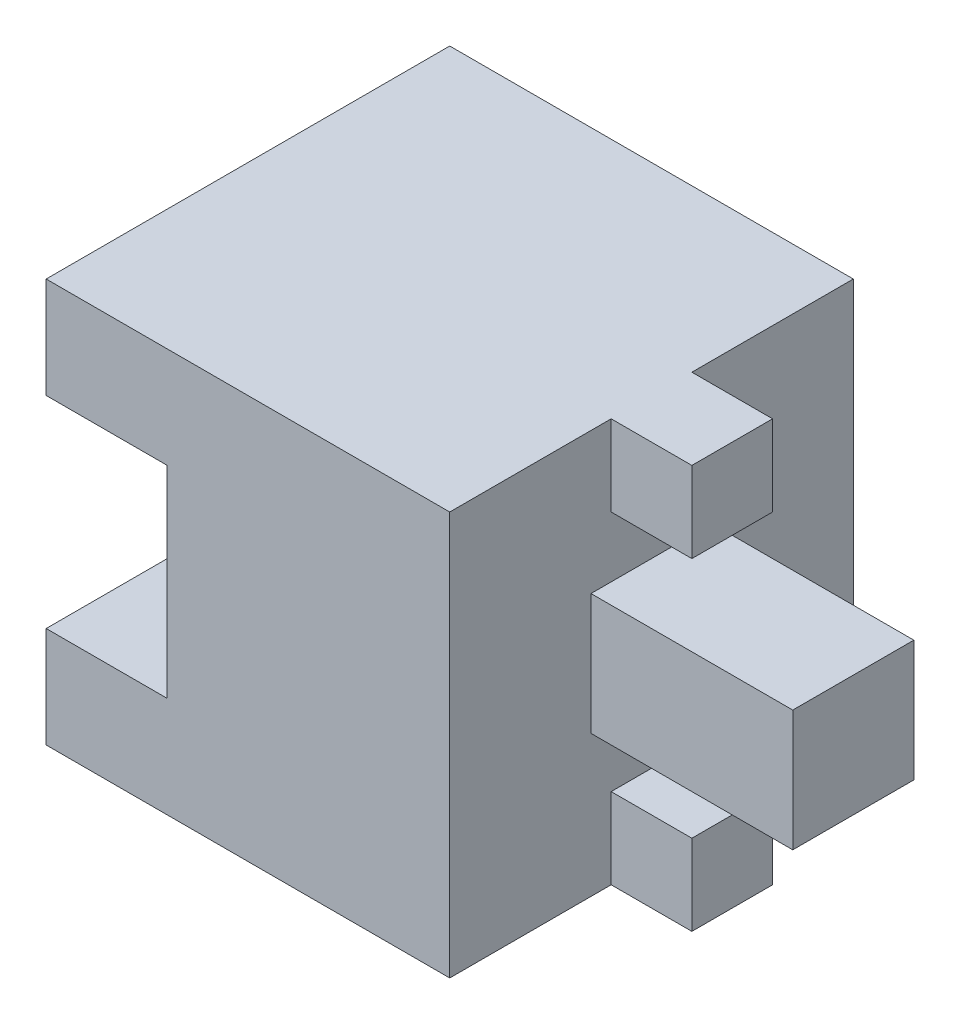
ISO-10303-21;
HEADER;
FILE_DESCRIPTION(('STEP AP214'),'2;1');
FILE_NAME('part.step','',(''),(''),'','','');
FILE_SCHEMA(('AUTOMOTIVE_DESIGN { 1 0 10303 214 1 1 1 1 }'));
ENDSEC;
DATA;
#1=APPLICATION_CONTEXT('core data for automotive mechanical design processes');
#2=APPLICATION_PROTOCOL_DEFINITION('international standard','automotive_design',2000,#1);
#3=PRODUCT_CONTEXT('',#1,'mechanical');
#4=PRODUCT('Part','Part','',(#3));
#5=PRODUCT_RELATED_PRODUCT_CATEGORY('part','',(#4));
#6=PRODUCT_DEFINITION_FORMATION('','',#4);
#7=PRODUCT_DEFINITION_CONTEXT('part definition',#1,'design');
#8=PRODUCT_DEFINITION('design','',#6,#7);
#9=PRODUCT_DEFINITION_SHAPE('','',#8);
#10=(LENGTH_UNIT() NAMED_UNIT(*) SI_UNIT(.MILLI.,.METRE.));
#11=(NAMED_UNIT(*) PLANE_ANGLE_UNIT() SI_UNIT($,.RADIAN.));
#12=(NAMED_UNIT(*) SI_UNIT($,.STERADIAN.) SOLID_ANGLE_UNIT());
#13=UNCERTAINTY_MEASURE_WITH_UNIT(LENGTH_MEASURE(1.E-05),#10,'distance_accuracy_value','');
#14=(GEOMETRIC_REPRESENTATION_CONTEXT(3) GLOBAL_UNCERTAINTY_ASSIGNED_CONTEXT((#13)) GLOBAL_UNIT_ASSIGNED_CONTEXT((#10,
#11,#12)) REPRESENTATION_CONTEXT('',''));
#15=CARTESIAN_POINT('',(0.,0.,0.));
#16=DIRECTION('',(0.,0.,1.));
#17=DIRECTION('',(1.,0.,0.));
#18=AXIS2_PLACEMENT_3D('',#15,#16,#17);
#19=CARTESIAN_POINT('',(5.,5.,5.));
#20=DIRECTION('',(-1.,0.,0.));
#21=DIRECTION('',(0.,0.,1.));
#22=AXIS2_PLACEMENT_3D('',#19,#20,#21);
#23=PLANE('',#22);
#24=DIRECTION('',(0.,1.,0.));
#25=VECTOR('',#24,1.);
#26=CARTESIAN_POINT('',(5.,-1.5,-1.5));
#27=LINE('',#26,#25);
#28=CARTESIAN_POINT('',(5.,-1.5,-1.5));
#29=VERTEX_POINT('',#28);
#30=CARTESIAN_POINT('',(5.,1.5,-1.5));
#31=VERTEX_POINT('',#30);
#32=EDGE_CURVE('E230',#29,#31,#27,.T.);
#33=ORIENTED_EDGE('',*,*,#32,.F.);
#34=DIRECTION('',(0.,0.,-1.));
#35=VECTOR('',#34,1.);
#36=CARTESIAN_POINT('',(5.,-1.5,1.5));
#37=LINE('',#36,#35);
#38=CARTESIAN_POINT('',(5.,-1.5,1.5));
#39=VERTEX_POINT('',#38);
#40=EDGE_CURVE('E235',#39,#29,#37,.T.);
#41=ORIENTED_EDGE('',*,*,#40,.F.);
#42=DIRECTION('',(0.,-1.,0.));
#43=VECTOR('',#42,1.);
#44=CARTESIAN_POINT('',(5.,-1.5,1.5));
#45=LINE('',#44,#43);
#46=CARTESIAN_POINT('',(5.,1.5,1.5));
#47=VERTEX_POINT('',#46);
#48=EDGE_CURVE('E247',#47,#39,#45,.T.);
#49=ORIENTED_EDGE('',*,*,#48,.F.);
#50=DIRECTION('',(0.,0.,1.));
#51=VECTOR('',#50,1.);
#52=CARTESIAN_POINT('',(5.,1.5,1.5));
#53=LINE('',#52,#51);
#54=EDGE_CURVE('E244',#31,#47,#53,.T.);
#55=ORIENTED_EDGE('',*,*,#54,.F.);
#56=EDGE_LOOP('',(#33,#41,#49,#55));
#57=FACE_BOUND('',#56,.T.);
#58=DIRECTION('',(0.,0.,-1.));
#59=VECTOR('',#58,1.);
#60=CARTESIAN_POINT('',(5.,-3.,1.));
#61=LINE('',#60,#59);
#62=CARTESIAN_POINT('',(5.,-3.,1.));
#63=VERTEX_POINT('',#62);
#64=CARTESIAN_POINT('',(5.,-3.,-1.));
#65=VERTEX_POINT('',#64);
#66=EDGE_CURVE('E47',#63,#65,#61,.T.);
#67=ORIENTED_EDGE('',*,*,#66,.T.);
#68=DIRECTION('',(0.,-1.,0.));
#69=VECTOR('',#68,1.);
#70=CARTESIAN_POINT('',(5.,-3.,-1.));
#71=LINE('',#70,#69);
#72=CARTESIAN_POINT('',(5.,-5.,-1.));
#73=VERTEX_POINT('',#72);
#74=EDGE_CURVE('E175',#65,#73,#71,.T.);
#75=ORIENTED_EDGE('',*,*,#74,.T.);
#76=DIRECTION('',(0.,0.,-1.));
#77=VECTOR('',#76,1.);
#78=CARTESIAN_POINT('',(5.,-5.,5.));
#79=LINE('',#78,#77);
#80=CARTESIAN_POINT('',(5.,-5.,-5.));
#81=VERTEX_POINT('',#80);
#82=EDGE_CURVE('E284',#73,#81,#79,.T.);
#83=ORIENTED_EDGE('',*,*,#82,.T.);
#84=DIRECTION('',(0.,-1.,0.));
#85=VECTOR('',#84,1.);
#86=CARTESIAN_POINT('',(5.,5.,-5.));
#87=LINE('',#86,#85);
#88=CARTESIAN_POINT('',(5.,5.,-5.));
#89=VERTEX_POINT('',#88);
#90=EDGE_CURVE('E11',#89,#81,#87,.T.);
#91=ORIENTED_EDGE('',*,*,#90,.F.);
#92=DIRECTION('',(0.,0.,-1.));
#93=VECTOR('',#92,1.);
#94=CARTESIAN_POINT('',(5.,5.,5.));
#95=LINE('',#94,#93);
#96=CARTESIAN_POINT('',(5.,5.,-1.));
#97=VERTEX_POINT('',#96);
#98=EDGE_CURVE('E294',#97,#89,#95,.T.);
#99=ORIENTED_EDGE('',*,*,#98,.F.);
#100=DIRECTION('',(0.,1.,0.));
#101=VECTOR('',#100,1.);
#102=CARTESIAN_POINT('',(5.,3.,-1.));
#103=LINE('',#102,#101);
#104=CARTESIAN_POINT('',(5.,3.,-1.));
#105=VERTEX_POINT('',#104);
#106=EDGE_CURVE('E178',#105,#97,#103,.T.);
#107=ORIENTED_EDGE('',*,*,#106,.F.);
#108=DIRECTION('',(0.,0.,-1.));
#109=VECTOR('',#108,1.);
#110=CARTESIAN_POINT('',(5.,3.,1.));
#111=LINE('',#110,#109);
#112=CARTESIAN_POINT('',(5.,3.,1.));
#113=VERTEX_POINT('',#112);
#114=EDGE_CURVE('E209',#113,#105,#111,.T.);
#115=ORIENTED_EDGE('',*,*,#114,.F.);
#116=DIRECTION('',(0.,-1.,0.));
#117=VECTOR('',#116,1.);
#118=CARTESIAN_POINT('',(5.,3.,1.));
#119=LINE('',#118,#117);
#120=CARTESIAN_POINT('',(5.,5.,1.));
#121=VERTEX_POINT('',#120);
#122=EDGE_CURVE('E217',#121,#113,#119,.T.);
#123=ORIENTED_EDGE('',*,*,#122,.F.);
#124=CARTESIAN_POINT('',(5.,5.,5.));
#125=VERTEX_POINT('',#124);
#126=EDGE_CURVE('E290',#125,#121,#95,.T.);
#127=ORIENTED_EDGE('',*,*,#126,.F.);
#128=DIRECTION('',(0.,-1.,0.));
#129=VECTOR('',#128,1.);
#130=CARTESIAN_POINT('',(5.,5.,5.));
#131=LINE('',#130,#129);
#132=CARTESIAN_POINT('',(5.,-5.,5.));
#133=VERTEX_POINT('',#132);
#134=EDGE_CURVE('E300',#125,#133,#131,.T.);
#135=ORIENTED_EDGE('',*,*,#134,.T.);
#136=CARTESIAN_POINT('',(5.,-5.,1.));
#137=VERTEX_POINT('',#136);
#138=EDGE_CURVE('E301',#133,#137,#79,.T.);
#139=ORIENTED_EDGE('',*,*,#138,.T.);
#140=DIRECTION('',(0.,1.,0.));
#141=VECTOR('',#140,1.);
#142=CARTESIAN_POINT('',(5.,-3.,1.));
#143=LINE('',#142,#141);
#144=EDGE_CURVE('E52',#137,#63,#143,.T.);
#145=ORIENTED_EDGE('',*,*,#144,.T.);
#146=EDGE_LOOP('',(#67,#75,#83,#91,#99,#107,#115,#123,#127,#135,#139,#145));
#147=FACE_BOUND('',#146,.T.);
#148=ADVANCED_FACE('F33',(#57,#147),#23,.F.);
#149=CARTESIAN_POINT('',(-5.,5.,5.));
#150=DIRECTION('',(1.,0.,0.));
#151=DIRECTION('',(0.,0.,-1.));
#152=AXIS2_PLACEMENT_3D('',#149,#150,#151);
#153=PLANE('',#152);
#154=DIRECTION('',(0.,-1.,0.));
#155=VECTOR('',#154,1.);
#156=CARTESIAN_POINT('',(-5.,5.,-5.));
#157=LINE('',#156,#155);
#158=CARTESIAN_POINT('',(-5.,5.,-5.));
#159=VERTEX_POINT('',#158);
#160=CARTESIAN_POINT('',(-5.,2.5,-5.));
#161=VERTEX_POINT('',#160);
#162=EDGE_CURVE('E40',#159,#161,#157,.T.);
#163=ORIENTED_EDGE('',*,*,#162,.T.);
#164=DIRECTION('',(0.,0.,1.));
#165=VECTOR('',#164,1.);
#166=CARTESIAN_POINT('',(-5.,2.5,-5.));
#167=LINE('',#166,#165);
#168=CARTESIAN_POINT('',(-5.,2.5,5.));
#169=VERTEX_POINT('',#168);
#170=EDGE_CURVE('E281',#161,#169,#167,.T.);
#171=ORIENTED_EDGE('',*,*,#170,.T.);
#172=DIRECTION('',(0.,-1.,0.));
#173=VECTOR('',#172,1.);
#174=CARTESIAN_POINT('',(-5.,5.,5.));
#175=LINE('',#174,#173);
#176=CARTESIAN_POINT('',(-5.,5.,5.));
#177=VERTEX_POINT('',#176);
#178=EDGE_CURVE('E314',#177,#169,#175,.T.);
#179=ORIENTED_EDGE('',*,*,#178,.F.);
#180=DIRECTION('',(0.,0.,1.));
#181=VECTOR('',#180,1.);
#182=CARTESIAN_POINT('',(-5.,5.,5.));
#183=LINE('',#182,#181);
#184=EDGE_CURVE('E296',#159,#177,#183,.T.);
#185=ORIENTED_EDGE('',*,*,#184,.F.);
#186=EDGE_LOOP('',(#163,#171,#179,#185));
#187=FACE_BOUND('',#186,.T.);
#188=ADVANCED_FACE('F351',(#187),#153,.F.);
#189=CARTESIAN_POINT('',(-5.,5.,-5.));
#190=DIRECTION('',(0.,0.,1.));
#191=DIRECTION('',(1.,0.,0.));
#192=AXIS2_PLACEMENT_3D('',#189,#190,#191);
#193=PLANE('',#192);
#194=DIRECTION('',(0.,1.,0.));
#195=VECTOR('',#194,1.);
#196=CARTESIAN_POINT('',(-2.,-2.5,-5.));
#197=LINE('',#196,#195);
#198=CARTESIAN_POINT('',(-2.,-2.5,-5.));
#199=VERTEX_POINT('',#198);
#200=CARTESIAN_POINT('',(-2.,2.5,-5.));
#201=VERTEX_POINT('',#200);
#202=EDGE_CURVE('E267',#199,#201,#197,.T.);
#203=ORIENTED_EDGE('',*,*,#202,.T.);
#204=DIRECTION('',(-1.,0.,0.));
#205=VECTOR('',#204,1.);
#206=CARTESIAN_POINT('',(-2.,2.5,-5.));
#207=LINE('',#206,#205);
#208=EDGE_CURVE('E271',#201,#161,#207,.T.);
#209=ORIENTED_EDGE('',*,*,#208,.T.);
#210=ORIENTED_EDGE('',*,*,#162,.F.);
#211=DIRECTION('',(-1.,0.,0.));
#212=VECTOR('',#211,1.);
#213=CARTESIAN_POINT('',(-5.,5.,-5.));
#214=LINE('',#213,#212);
#215=EDGE_CURVE('E293',#89,#159,#214,.T.);
#216=ORIENTED_EDGE('',*,*,#215,.F.);
#217=ORIENTED_EDGE('',*,*,#90,.T.);
#218=DIRECTION('',(-1.,0.,0.));
#219=VECTOR('',#218,1.);
#220=CARTESIAN_POINT('',(-5.,-5.,-5.));
#221=LINE('',#220,#219);
#222=CARTESIAN_POINT('',(-5.,-5.,-5.));
#223=VERTEX_POINT('',#222);
#224=EDGE_CURVE('E303',#81,#223,#221,.T.);
#225=ORIENTED_EDGE('',*,*,#224,.T.);
#226=CARTESIAN_POINT('',(-5.,-2.5,-5.));
#227=VERTEX_POINT('',#226);
#228=EDGE_CURVE('E316',#227,#223,#157,.T.);
#229=ORIENTED_EDGE('',*,*,#228,.F.);
#230=DIRECTION('',(1.,0.,0.));
#231=VECTOR('',#230,1.);
#232=CARTESIAN_POINT('',(-2.,-2.5,-5.));
#233=LINE('',#232,#231);
#234=EDGE_CURVE('E264',#227,#199,#233,.T.);
#235=ORIENTED_EDGE('',*,*,#234,.T.);
#236=EDGE_LOOP('',(#203,#209,#210,#216,#217,#225,#229,#235));
#237=FACE_BOUND('',#236,.T.);
#238=ADVANCED_FACE('F330',(#237),#193,.F.);
#239=CARTESIAN_POINT('',(-5.,-2.5,5.));
#240=VERTEX_POINT('',#239);
#241=CARTESIAN_POINT('',(-5.,-5.,5.));
#242=VERTEX_POINT('',#241);
#243=EDGE_CURVE('E313',#240,#242,#175,.T.);
#244=ORIENTED_EDGE('',*,*,#243,.F.);
#245=DIRECTION('',(0.,0.,1.));
#246=VECTOR('',#245,1.);
#247=CARTESIAN_POINT('',(-5.,-2.5,-5.));
#248=LINE('',#247,#246);
#249=EDGE_CURVE('E274',#227,#240,#248,.T.);
#250=ORIENTED_EDGE('',*,*,#249,.F.);
#251=ORIENTED_EDGE('',*,*,#228,.T.);
#252=DIRECTION('',(0.,0.,1.));
#253=VECTOR('',#252,1.);
#254=CARTESIAN_POINT('',(-5.,-5.,5.));
#255=LINE('',#254,#253);
#256=EDGE_CURVE('E306',#223,#242,#255,.T.);
#257=ORIENTED_EDGE('',*,*,#256,.T.);
#258=EDGE_LOOP('',(#244,#250,#251,#257));
#259=FACE_BOUND('',#258,.T.);
#260=ADVANCED_FACE('F325',(#259),#153,.F.);
#261=CARTESIAN_POINT('',(-5.,5.,5.));
#262=DIRECTION('',(0.,0.,-1.));
#263=DIRECTION('',(-1.,0.,0.));
#264=AXIS2_PLACEMENT_3D('',#261,#262,#263);
#265=PLANE('',#264);
#266=ORIENTED_EDGE('',*,*,#178,.T.);
#267=DIRECTION('',(-1.,0.,0.));
#268=VECTOR('',#267,1.);
#269=CARTESIAN_POINT('',(-2.,2.5,5.));
#270=LINE('',#269,#268);
#271=CARTESIAN_POINT('',(-2.,2.5,5.));
#272=VERTEX_POINT('',#271);
#273=EDGE_CURVE('E268',#272,#169,#270,.T.);
#274=ORIENTED_EDGE('',*,*,#273,.F.);
#275=DIRECTION('',(0.,1.,0.));
#276=VECTOR('',#275,1.);
#277=CARTESIAN_POINT('',(-2.,-2.5,5.));
#278=LINE('',#277,#276);
#279=CARTESIAN_POINT('',(-2.,-2.5,5.));
#280=VERTEX_POINT('',#279);
#281=EDGE_CURVE('E277',#280,#272,#278,.T.);
#282=ORIENTED_EDGE('',*,*,#281,.F.);
#283=DIRECTION('',(1.,0.,0.));
#284=VECTOR('',#283,1.);
#285=CARTESIAN_POINT('',(-2.,-2.5,5.));
#286=LINE('',#285,#284);
#287=EDGE_CURVE('E263',#240,#280,#286,.T.);
#288=ORIENTED_EDGE('',*,*,#287,.F.);
#289=ORIENTED_EDGE('',*,*,#243,.T.);
#290=DIRECTION('',(1.,0.,0.));
#291=VECTOR('',#290,1.);
#292=CARTESIAN_POINT('',(-5.,-5.,5.));
#293=LINE('',#292,#291);
#294=EDGE_CURVE('E309',#242,#133,#293,.T.);
#295=ORIENTED_EDGE('',*,*,#294,.T.);
#296=ORIENTED_EDGE('',*,*,#134,.F.);
#297=DIRECTION('',(1.,0.,0.));
#298=VECTOR('',#297,1.);
#299=CARTESIAN_POINT('',(-5.,5.,5.));
#300=LINE('',#299,#298);
#301=EDGE_CURVE('E298',#177,#125,#300,.T.);
#302=ORIENTED_EDGE('',*,*,#301,.F.);
#303=EDGE_LOOP('',(#266,#274,#282,#288,#289,#295,#296,#302));
#304=FACE_BOUND('',#303,.T.);
#305=ADVANCED_FACE('F338',(#304),#265,.F.);
#306=CARTESIAN_POINT('',(0.,5.,0.));
#307=DIRECTION('',(0.,-1.,0.));
#308=DIRECTION('',(0.,0.,-1.));
#309=AXIS2_PLACEMENT_3D('',#306,#307,#308);
#310=PLANE('',#309);
#311=ORIENTED_EDGE('',*,*,#126,.T.);
#312=DIRECTION('',(-1.,0.,0.));
#313=VECTOR('',#312,1.);
#314=CARTESIAN_POINT('',(7.,5.,1.));
#315=LINE('',#314,#313);
#316=CARTESIAN_POINT('',(7.,5.,1.));
#317=VERTEX_POINT('',#316);
#318=EDGE_CURVE('E225',#317,#121,#315,.T.);
#319=ORIENTED_EDGE('',*,*,#318,.F.);
#320=DIRECTION('',(0.,0.,1.));
#321=VECTOR('',#320,1.);
#322=CARTESIAN_POINT('',(7.,5.,1.));
#323=LINE('',#322,#321);
#324=CARTESIAN_POINT('',(7.,5.,-1.));
#325=VERTEX_POINT('',#324);
#326=EDGE_CURVE('E208',#325,#317,#323,.T.);
#327=ORIENTED_EDGE('',*,*,#326,.F.);
#328=DIRECTION('',(-1.,0.,0.));
#329=VECTOR('',#328,1.);
#330=CARTESIAN_POINT('',(7.,5.,-1.));
#331=LINE('',#330,#329);
#332=EDGE_CURVE('E227',#325,#97,#331,.T.);
#333=ORIENTED_EDGE('',*,*,#332,.T.);
#334=ORIENTED_EDGE('',*,*,#98,.T.);
#335=ORIENTED_EDGE('',*,*,#215,.T.);
#336=ORIENTED_EDGE('',*,*,#184,.T.);
#337=ORIENTED_EDGE('',*,*,#301,.T.);
#338=EDGE_LOOP('',(#311,#319,#327,#333,#334,#335,#336,#337));
#339=FACE_BOUND('',#338,.T.);
#340=ADVANCED_FACE('F346',(#339),#310,.F.);
#341=CARTESIAN_POINT('',(0.,-5.,0.));
#342=DIRECTION('',(0.,-1.,0.));
#343=DIRECTION('',(0.,0.,-1.));
#344=AXIS2_PLACEMENT_3D('',#341,#342,#343);
#345=PLANE('',#344);
#346=ORIENTED_EDGE('',*,*,#138,.F.);
#347=ORIENTED_EDGE('',*,*,#294,.F.);
#348=ORIENTED_EDGE('',*,*,#256,.F.);
#349=ORIENTED_EDGE('',*,*,#224,.F.);
#350=ORIENTED_EDGE('',*,*,#82,.F.);
#351=DIRECTION('',(-1.,0.,0.));
#352=VECTOR('',#351,1.);
#353=CARTESIAN_POINT('',(7.,-5.,-1.));
#354=LINE('',#353,#352);
#355=CARTESIAN_POINT('',(7.,-5.,-1.));
#356=VERTEX_POINT('',#355);
#357=EDGE_CURVE('E196',#356,#73,#354,.T.);
#358=ORIENTED_EDGE('',*,*,#357,.F.);
#359=DIRECTION('',(0.,0.,1.));
#360=VECTOR('',#359,1.);
#361=CARTESIAN_POINT('',(7.,-5.,1.));
#362=LINE('',#361,#360);
#363=CARTESIAN_POINT('',(7.,-5.,1.));
#364=VERTEX_POINT('',#363);
#365=EDGE_CURVE('E188',#356,#364,#362,.T.);
#366=ORIENTED_EDGE('',*,*,#365,.T.);
#367=DIRECTION('',(-1.,0.,0.));
#368=VECTOR('',#367,1.);
#369=CARTESIAN_POINT('',(7.,-5.,1.));
#370=LINE('',#369,#368);
#371=EDGE_CURVE('E201',#364,#137,#370,.T.);
#372=ORIENTED_EDGE('',*,*,#371,.T.);
#373=EDGE_LOOP('',(#346,#347,#348,#349,#350,#358,#366,#372));
#374=FACE_BOUND('',#373,.T.);
#375=ADVANCED_FACE('F335',(#374),#345,.T.);
#376=CARTESIAN_POINT('',(-2.,2.5,-5.));
#377=DIRECTION('',(0.,1.,0.));
#378=DIRECTION('',(0.,0.,1.));
#379=AXIS2_PLACEMENT_3D('',#376,#377,#378);
#380=PLANE('',#379);
#381=ORIENTED_EDGE('',*,*,#273,.T.);
#382=ORIENTED_EDGE('',*,*,#170,.F.);
#383=ORIENTED_EDGE('',*,*,#208,.F.);
#384=DIRECTION('',(0.,0.,1.));
#385=VECTOR('',#384,1.);
#386=CARTESIAN_POINT('',(-2.,2.5,-5.));
#387=LINE('',#386,#385);
#388=EDGE_CURVE('E285',#201,#272,#387,.T.);
#389=ORIENTED_EDGE('',*,*,#388,.T.);
#390=EDGE_LOOP('',(#381,#382,#383,#389));
#391=FACE_BOUND('',#390,.T.);
#392=ADVANCED_FACE('F354',(#391),#380,.F.);
#393=CARTESIAN_POINT('',(-2.,-2.5,-5.));
#394=DIRECTION('',(1.,0.,0.));
#395=DIRECTION('',(0.,0.,-1.));
#396=AXIS2_PLACEMENT_3D('',#393,#394,#395);
#397=PLANE('',#396);
#398=ORIENTED_EDGE('',*,*,#281,.T.);
#399=ORIENTED_EDGE('',*,*,#388,.F.);
#400=ORIENTED_EDGE('',*,*,#202,.F.);
#401=DIRECTION('',(0.,0.,1.));
#402=VECTOR('',#401,1.);
#403=CARTESIAN_POINT('',(-2.,-2.5,-5.));
#404=LINE('',#403,#402);
#405=EDGE_CURVE('E287',#199,#280,#404,.T.);
#406=ORIENTED_EDGE('',*,*,#405,.T.);
#407=EDGE_LOOP('',(#398,#399,#400,#406));
#408=FACE_BOUND('',#407,.T.);
#409=ADVANCED_FACE('F357',(#408),#397,.F.);
#410=CARTESIAN_POINT('',(-2.,-2.5,-5.));
#411=DIRECTION('',(0.,-1.,0.));
#412=DIRECTION('',(1.,0.,0.));
#413=AXIS2_PLACEMENT_3D('',#410,#411,#412);
#414=PLANE('',#413);
#415=ORIENTED_EDGE('',*,*,#287,.T.);
#416=ORIENTED_EDGE('',*,*,#405,.F.);
#417=ORIENTED_EDGE('',*,*,#234,.F.);
#418=ORIENTED_EDGE('',*,*,#249,.T.);
#419=EDGE_LOOP('',(#415,#416,#417,#418));
#420=FACE_BOUND('',#419,.T.);
#421=ADVANCED_FACE('F359',(#420),#414,.F.);
#422=CARTESIAN_POINT('',(10.,-1.5,-1.5));
#423=DIRECTION('',(0.,0.,1.));
#424=DIRECTION('',(1.,0.,0.));
#425=AXIS2_PLACEMENT_3D('',#422,#423,#424);
#426=PLANE('',#425);
#427=ORIENTED_EDGE('',*,*,#32,.T.);
#428=DIRECTION('',(-1.,0.,0.));
#429=VECTOR('',#428,1.);
#430=CARTESIAN_POINT('',(10.,1.5,-1.5));
#431=LINE('',#430,#429);
#432=CARTESIAN_POINT('',(10.,1.5,-1.5));
#433=VERTEX_POINT('',#432);
#434=EDGE_CURVE('E260',#433,#31,#431,.T.);
#435=ORIENTED_EDGE('',*,*,#434,.F.);
#436=DIRECTION('',(0.,1.,0.));
#437=VECTOR('',#436,1.);
#438=CARTESIAN_POINT('',(10.,-1.5,-1.5));
#439=LINE('',#438,#437);
#440=CARTESIAN_POINT('',(10.,-1.5,-1.5));
#441=VERTEX_POINT('',#440);
#442=EDGE_CURVE('E231',#441,#433,#439,.T.);
#443=ORIENTED_EDGE('',*,*,#442,.F.);
#444=DIRECTION('',(-1.,0.,0.));
#445=VECTOR('',#444,1.);
#446=CARTESIAN_POINT('',(10.,-1.5,-1.5));
#447=LINE('',#446,#445);
#448=EDGE_CURVE('E241',#441,#29,#447,.T.);
#449=ORIENTED_EDGE('',*,*,#448,.T.);
#450=EDGE_LOOP('',(#427,#435,#443,#449));
#451=FACE_BOUND('',#450,.T.);
#452=ADVANCED_FACE('F361',(#451),#426,.F.);
#453=CARTESIAN_POINT('',(10.,1.5,1.5));
#454=DIRECTION('',(0.,-1.,0.));
#455=DIRECTION('',(0.,0.,-1.));
#456=AXIS2_PLACEMENT_3D('',#453,#454,#455);
#457=PLANE('',#456);
#458=ORIENTED_EDGE('',*,*,#54,.T.);
#459=DIRECTION('',(-1.,0.,0.));
#460=VECTOR('',#459,1.);
#461=CARTESIAN_POINT('',(10.,1.5,1.5));
#462=LINE('',#461,#460);
#463=CARTESIAN_POINT('',(10.,1.5,1.5));
#464=VERTEX_POINT('',#463);
#465=EDGE_CURVE('E257',#464,#47,#462,.T.);
#466=ORIENTED_EDGE('',*,*,#465,.F.);
#467=DIRECTION('',(0.,0.,1.));
#468=VECTOR('',#467,1.);
#469=CARTESIAN_POINT('',(10.,1.5,1.5));
#470=LINE('',#469,#468);
#471=EDGE_CURVE('E234',#433,#464,#470,.T.);
#472=ORIENTED_EDGE('',*,*,#471,.F.);
#473=ORIENTED_EDGE('',*,*,#434,.T.);
#474=EDGE_LOOP('',(#458,#466,#472,#473));
#475=FACE_BOUND('',#474,.T.);
#476=ADVANCED_FACE('F367',(#475),#457,.F.);
#477=CARTESIAN_POINT('',(10.,-1.5,1.5));
#478=DIRECTION('',(0.,0.,-1.));
#479=DIRECTION('',(-1.,0.,0.));
#480=AXIS2_PLACEMENT_3D('',#477,#478,#479);
#481=PLANE('',#480);
#482=ORIENTED_EDGE('',*,*,#48,.T.);
#483=DIRECTION('',(-1.,0.,0.));
#484=VECTOR('',#483,1.);
#485=CARTESIAN_POINT('',(10.,-1.5,1.5));
#486=LINE('',#485,#484);
#487=CARTESIAN_POINT('',(10.,-1.5,1.5));
#488=VERTEX_POINT('',#487);
#489=EDGE_CURVE('E254',#488,#39,#486,.T.);
#490=ORIENTED_EDGE('',*,*,#489,.F.);
#491=DIRECTION('',(0.,-1.,0.));
#492=VECTOR('',#491,1.);
#493=CARTESIAN_POINT('',(10.,-1.5,1.5));
#494=LINE('',#493,#492);
#495=EDGE_CURVE('E237',#464,#488,#494,.T.);
#496=ORIENTED_EDGE('',*,*,#495,.F.);
#497=ORIENTED_EDGE('',*,*,#465,.T.);
#498=EDGE_LOOP('',(#482,#490,#496,#497));
#499=FACE_BOUND('',#498,.T.);
#500=ADVANCED_FACE('F392',(#499),#481,.F.);
#501=CARTESIAN_POINT('',(10.,-1.5,1.5));
#502=DIRECTION('',(0.,1.,0.));
#503=DIRECTION('',(0.,0.,1.));
#504=AXIS2_PLACEMENT_3D('',#501,#502,#503);
#505=PLANE('',#504);
#506=ORIENTED_EDGE('',*,*,#40,.T.);
#507=ORIENTED_EDGE('',*,*,#448,.F.);
#508=DIRECTION('',(0.,0.,-1.));
#509=VECTOR('',#508,1.);
#510=CARTESIAN_POINT('',(10.,-1.5,1.5));
#511=LINE('',#510,#509);
#512=EDGE_CURVE('E239',#488,#441,#511,.T.);
#513=ORIENTED_EDGE('',*,*,#512,.F.);
#514=ORIENTED_EDGE('',*,*,#489,.T.);
#515=EDGE_LOOP('',(#506,#507,#513,#514));
#516=FACE_BOUND('',#515,.T.);
#517=ADVANCED_FACE('F383',(#516),#505,.F.);
#518=CARTESIAN_POINT('',(10.,0.,0.));
#519=DIRECTION('',(-1.,0.,0.));
#520=DIRECTION('',(0.,0.,1.));
#521=AXIS2_PLACEMENT_3D('',#518,#519,#520);
#522=PLANE('',#521);
#523=ORIENTED_EDGE('',*,*,#442,.T.);
#524=ORIENTED_EDGE('',*,*,#471,.T.);
#525=ORIENTED_EDGE('',*,*,#495,.T.);
#526=ORIENTED_EDGE('',*,*,#512,.T.);
#527=EDGE_LOOP('',(#523,#524,#525,#526));
#528=FACE_BOUND('',#527,.T.);
#529=ADVANCED_FACE('F388',(#528),#522,.F.);
#530=CARTESIAN_POINT('',(7.,3.,-1.));
#531=DIRECTION('',(0.,0.,1.));
#532=DIRECTION('',(1.,0.,0.));
#533=AXIS2_PLACEMENT_3D('',#530,#531,#532);
#534=PLANE('',#533);
#535=ORIENTED_EDGE('',*,*,#106,.T.);
#536=ORIENTED_EDGE('',*,*,#332,.F.);
#537=DIRECTION('',(0.,1.,0.));
#538=VECTOR('',#537,1.);
#539=CARTESIAN_POINT('',(7.,3.,-1.));
#540=LINE('',#539,#538);
#541=CARTESIAN_POINT('',(7.,3.,-1.));
#542=VERTEX_POINT('',#541);
#543=EDGE_CURVE('E205',#542,#325,#540,.T.);
#544=ORIENTED_EDGE('',*,*,#543,.F.);
#545=DIRECTION('',(-1.,0.,0.));
#546=VECTOR('',#545,1.);
#547=CARTESIAN_POINT('',(7.,3.,-1.));
#548=LINE('',#547,#546);
#549=EDGE_CURVE('E215',#542,#105,#548,.T.);
#550=ORIENTED_EDGE('',*,*,#549,.T.);
#551=EDGE_LOOP('',(#535,#536,#544,#550));
#552=FACE_BOUND('',#551,.T.);
#553=ADVANCED_FACE('F474',(#552),#534,.F.);
#554=CARTESIAN_POINT('',(7.,3.,1.));
#555=DIRECTION('',(0.,0.,-1.));
#556=DIRECTION('',(-1.,0.,0.));
#557=AXIS2_PLACEMENT_3D('',#554,#555,#556);
#558=PLANE('',#557);
#559=ORIENTED_EDGE('',*,*,#122,.T.);
#560=DIRECTION('',(-1.,0.,0.));
#561=VECTOR('',#560,1.);
#562=CARTESIAN_POINT('',(7.,3.,1.));
#563=LINE('',#562,#561);
#564=CARTESIAN_POINT('',(7.,3.,1.));
#565=VERTEX_POINT('',#564);
#566=EDGE_CURVE('E222',#565,#113,#563,.T.);
#567=ORIENTED_EDGE('',*,*,#566,.F.);
#568=DIRECTION('',(0.,-1.,0.));
#569=VECTOR('',#568,1.);
#570=CARTESIAN_POINT('',(7.,3.,1.));
#571=LINE('',#570,#569);
#572=EDGE_CURVE('E211',#317,#565,#571,.T.);
#573=ORIENTED_EDGE('',*,*,#572,.F.);
#574=ORIENTED_EDGE('',*,*,#318,.T.);
#575=EDGE_LOOP('',(#559,#567,#573,#574));
#576=FACE_BOUND('',#575,.T.);
#577=ADVANCED_FACE('F489',(#576),#558,.F.);
#578=CARTESIAN_POINT('',(7.,3.,1.));
#579=DIRECTION('',(0.,1.,0.));
#580=DIRECTION('',(0.,0.,1.));
#581=AXIS2_PLACEMENT_3D('',#578,#579,#580);
#582=PLANE('',#581);
#583=ORIENTED_EDGE('',*,*,#114,.T.);
#584=ORIENTED_EDGE('',*,*,#549,.F.);
#585=DIRECTION('',(0.,0.,-1.));
#586=VECTOR('',#585,1.);
#587=CARTESIAN_POINT('',(7.,3.,1.));
#588=LINE('',#587,#586);
#589=EDGE_CURVE('E213',#565,#542,#588,.T.);
#590=ORIENTED_EDGE('',*,*,#589,.F.);
#591=ORIENTED_EDGE('',*,*,#566,.T.);
#592=EDGE_LOOP('',(#583,#584,#590,#591));
#593=FACE_BOUND('',#592,.T.);
#594=ADVANCED_FACE('F499',(#593),#582,.F.);
#595=CARTESIAN_POINT('',(7.,0.,0.));
#596=DIRECTION('',(-1.,0.,0.));
#597=DIRECTION('',(0.,0.,1.));
#598=AXIS2_PLACEMENT_3D('',#595,#596,#597);
#599=PLANE('',#598);
#600=ORIENTED_EDGE('',*,*,#543,.T.);
#601=ORIENTED_EDGE('',*,*,#326,.T.);
#602=ORIENTED_EDGE('',*,*,#572,.T.);
#603=ORIENTED_EDGE('',*,*,#589,.T.);
#604=EDGE_LOOP('',(#600,#601,#602,#603));
#605=FACE_BOUND('',#604,.T.);
#606=ADVANCED_FACE('F508',(#605),#599,.F.);
#607=CARTESIAN_POINT('',(7.,-3.,-1.));
#608=DIRECTION('',(0.,0.,-1.));
#609=DIRECTION('',(-1.,0.,0.));
#610=AXIS2_PLACEMENT_3D('',#607,#608,#609);
#611=PLANE('',#610);
#612=ORIENTED_EDGE('',*,*,#74,.F.);
#613=DIRECTION('',(-1.,0.,0.));
#614=VECTOR('',#613,1.);
#615=CARTESIAN_POINT('',(7.,-3.,-1.));
#616=LINE('',#615,#614);
#617=CARTESIAN_POINT('',(7.,-3.,-1.));
#618=VERTEX_POINT('',#617);
#619=EDGE_CURVE('E169',#618,#65,#616,.T.);
#620=ORIENTED_EDGE('',*,*,#619,.F.);
#621=DIRECTION('',(0.,-1.,0.));
#622=VECTOR('',#621,1.);
#623=CARTESIAN_POINT('',(7.,-3.,-1.));
#624=LINE('',#623,#622);
#625=EDGE_CURVE('E173',#618,#356,#624,.T.);
#626=ORIENTED_EDGE('',*,*,#625,.T.);
#627=ORIENTED_EDGE('',*,*,#357,.T.);
#628=EDGE_LOOP('',(#612,#620,#626,#627));
#629=FACE_BOUND('',#628,.T.);
#630=ADVANCED_FACE('F171',(#629),#611,.T.);
#631=CARTESIAN_POINT('',(7.,-3.,1.));
#632=DIRECTION('',(0.,1.,0.));
#633=DIRECTION('',(0.,0.,1.));
#634=AXIS2_PLACEMENT_3D('',#631,#632,#633);
#635=PLANE('',#634);
#636=ORIENTED_EDGE('',*,*,#66,.F.);
#637=DIRECTION('',(-1.,0.,0.));
#638=VECTOR('',#637,1.);
#639=CARTESIAN_POINT('',(7.,-3.,1.));
#640=LINE('',#639,#638);
#641=CARTESIAN_POINT('',(7.,-3.,1.));
#642=VERTEX_POINT('',#641);
#643=EDGE_CURVE('E179',#642,#63,#640,.T.);
#644=ORIENTED_EDGE('',*,*,#643,.F.);
#645=DIRECTION('',(0.,0.,-1.));
#646=VECTOR('',#645,1.);
#647=CARTESIAN_POINT('',(7.,-3.,1.));
#648=LINE('',#647,#646);
#649=EDGE_CURVE('E185',#642,#618,#648,.T.);
#650=ORIENTED_EDGE('',*,*,#649,.T.);
#651=ORIENTED_EDGE('',*,*,#619,.T.);
#652=EDGE_LOOP('',(#636,#644,#650,#651));
#653=FACE_BOUND('',#652,.T.);
#654=ADVANCED_FACE('F190',(#653),#635,.T.);
#655=CARTESIAN_POINT('',(7.,-3.,1.));
#656=DIRECTION('',(0.,0.,1.));
#657=DIRECTION('',(1.,0.,0.));
#658=AXIS2_PLACEMENT_3D('',#655,#656,#657);
#659=PLANE('',#658);
#660=ORIENTED_EDGE('',*,*,#144,.F.);
#661=ORIENTED_EDGE('',*,*,#371,.F.);
#662=DIRECTION('',(0.,1.,0.));
#663=VECTOR('',#662,1.);
#664=CARTESIAN_POINT('',(7.,-3.,1.));
#665=LINE('',#664,#663);
#666=EDGE_CURVE('E191',#364,#642,#665,.T.);
#667=ORIENTED_EDGE('',*,*,#666,.T.);
#668=ORIENTED_EDGE('',*,*,#643,.T.);
#669=EDGE_LOOP('',(#660,#661,#667,#668));
#670=FACE_BOUND('',#669,.T.);
#671=ADVANCED_FACE('F533',(#670),#659,.T.);
#672=CARTESIAN_POINT('',(7.,0.,0.));
#673=DIRECTION('',(-1.,0.,0.));
#674=DIRECTION('',(0.,0.,1.));
#675=AXIS2_PLACEMENT_3D('',#672,#673,#674);
#676=PLANE('',#675);
#677=ORIENTED_EDGE('',*,*,#625,.F.);
#678=ORIENTED_EDGE('',*,*,#649,.F.);
#679=ORIENTED_EDGE('',*,*,#666,.F.);
#680=ORIENTED_EDGE('',*,*,#365,.F.);
#681=EDGE_LOOP('',(#677,#678,#679,#680));
#682=FACE_BOUND('',#681,.T.);
#683=ADVANCED_FACE('F183',(#682),#676,.F.);
#684=CLOSED_SHELL('',(#148,#188,#238,#260,#305,#340,#375,#392,#409,#421,#452,#476,#500,#517,
#529,#553,#577,#594,#606,#630,#654,#671,#683));
#685=MANIFOLD_SOLID_BREP('B2',#684);
#686=ADVANCED_BREP_SHAPE_REPRESENTATION('',(#18,#685),#14);
#687=SHAPE_DEFINITION_REPRESENTATION(#9,#686);
ENDSEC;
END-ISO-10303-21;
